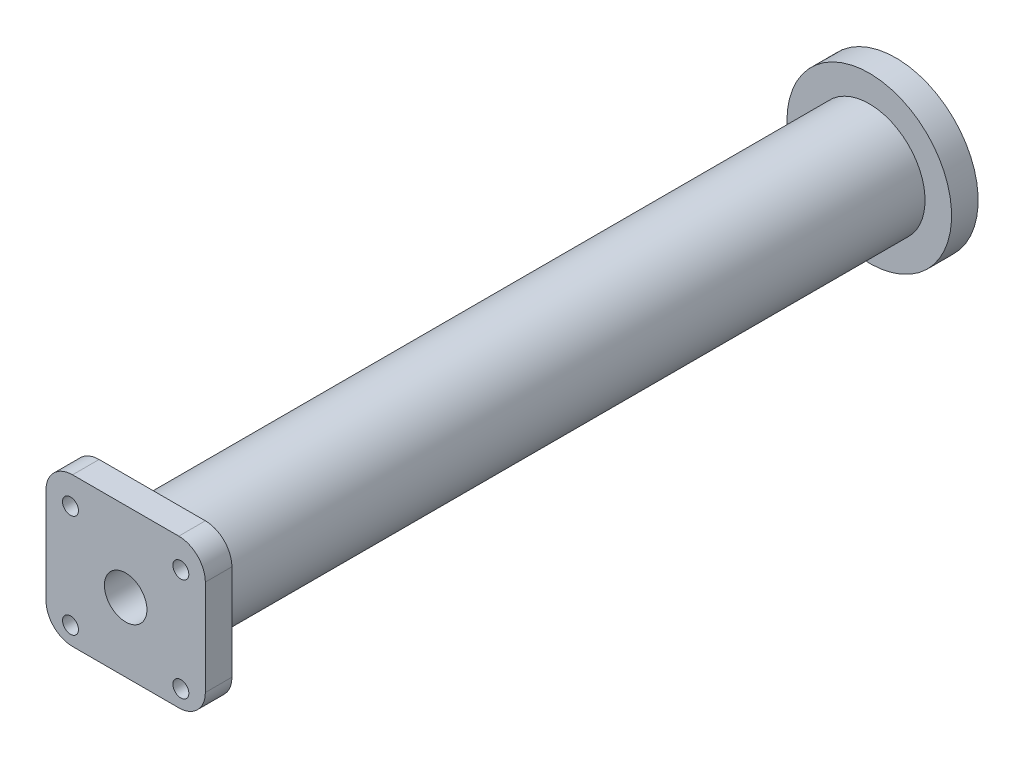
ISO-10303-21;
HEADER;
FILE_DESCRIPTION(('STEP AP214'),'2;1');
FILE_NAME('part.step','',(''),(''),'','','');
FILE_SCHEMA(('AUTOMOTIVE_DESIGN { 1 0 10303 214 1 1 1 1 }'));
ENDSEC;
DATA;
#1=APPLICATION_CONTEXT('core data for automotive mechanical design processes');
#2=APPLICATION_PROTOCOL_DEFINITION('international standard','automotive_design',2000,#1);
#3=PRODUCT_CONTEXT('',#1,'mechanical');
#4=PRODUCT('Part','Part','',(#3));
#5=PRODUCT_RELATED_PRODUCT_CATEGORY('part','',(#4));
#6=PRODUCT_DEFINITION_FORMATION('','',#4);
#7=PRODUCT_DEFINITION_CONTEXT('part definition',#1,'design');
#8=PRODUCT_DEFINITION('design','',#6,#7);
#9=PRODUCT_DEFINITION_SHAPE('','',#8);
#10=(LENGTH_UNIT() NAMED_UNIT(*) SI_UNIT(.MILLI.,.METRE.));
#11=(NAMED_UNIT(*) PLANE_ANGLE_UNIT() SI_UNIT($,.RADIAN.));
#12=(NAMED_UNIT(*) SI_UNIT($,.STERADIAN.) SOLID_ANGLE_UNIT());
#13=UNCERTAINTY_MEASURE_WITH_UNIT(LENGTH_MEASURE(1.E-05),#10,'distance_accuracy_value','');
#14=(GEOMETRIC_REPRESENTATION_CONTEXT(3) GLOBAL_UNCERTAINTY_ASSIGNED_CONTEXT((#13)) GLOBAL_UNIT_ASSIGNED_CONTEXT((#10,
#11,#12)) REPRESENTATION_CONTEXT('',''));
#15=CARTESIAN_POINT('',(0.,0.,0.));
#16=DIRECTION('',(0.,0.,1.));
#17=DIRECTION('',(1.,0.,0.));
#18=AXIS2_PLACEMENT_3D('',#15,#16,#17);
#19=CARTESIAN_POINT('',(0.,0.,140.));
#20=DIRECTION('',(0.,0.,-1.));
#21=DIRECTION('',(-1.,0.,0.));
#22=AXIS2_PLACEMENT_3D('',#19,#20,#21);
#23=CYLINDRICAL_SURFACE('',#22,10.5);
#24=CARTESIAN_POINT('',(0.,0.,140.));
#25=DIRECTION('',(0.,0.,1.));
#26=DIRECTION('',(1.,0.,0.));
#27=AXIS2_PLACEMENT_3D('',#24,#25,#26);
#28=CIRCLE('',#27,10.5);
#29=CARTESIAN_POINT('',(10.5,0.,140.));
#30=VERTEX_POINT('',#29);
#31=EDGE_CURVE('E159',#30,#30,#28,.T.);
#32=ORIENTED_EDGE('',*,*,#31,.F.);
#33=EDGE_LOOP('',(#32));
#34=FACE_BOUND('',#33,.T.);
#35=CARTESIAN_POINT('',(0.,0.,5.));
#36=DIRECTION('',(0.,0.,-1.));
#37=DIRECTION('',(-1.,0.,0.));
#38=AXIS2_PLACEMENT_3D('',#35,#36,#37);
#39=CIRCLE('',#38,10.5);
#40=CARTESIAN_POINT('',(-10.5,0.,5.));
#41=VERTEX_POINT('',#40);
#42=EDGE_CURVE('E12',#41,#41,#39,.T.);
#43=ORIENTED_EDGE('',*,*,#42,.F.);
#44=EDGE_LOOP('',(#43));
#45=FACE_BOUND('',#44,.T.);
#46=ADVANCED_FACE('F45',(#34,#45),#23,.T.);
#47=CARTESIAN_POINT('',(0.,0.,0.));
#48=DIRECTION('',(0.,0.,1.));
#49=DIRECTION('',(1.,0.,0.));
#50=AXIS2_PLACEMENT_3D('',#47,#48,#49);
#51=PLANE('',#50);
#52=CARTESIAN_POINT('',(0.,0.,0.));
#53=DIRECTION('',(0.,0.,1.));
#54=DIRECTION('',(1.,0.,0.));
#55=AXIS2_PLACEMENT_3D('',#52,#53,#54);
#56=CIRCLE('',#55,4.);
#57=CARTESIAN_POINT('',(4.,0.,0.));
#58=VERTEX_POINT('',#57);
#59=EDGE_CURVE('E156',#58,#58,#56,.T.);
#60=ORIENTED_EDGE('',*,*,#59,.T.);
#61=EDGE_LOOP('',(#60));
#62=FACE_BOUND('',#61,.T.);
#63=CARTESIAN_POINT('',(0.,0.,0.));
#64=DIRECTION('',(0.,0.,-1.));
#65=DIRECTION('',(-1.,0.,0.));
#66=AXIS2_PLACEMENT_3D('',#63,#64,#65);
#67=CIRCLE('',#66,15.5);
#68=CARTESIAN_POINT('',(-15.5,0.,0.));
#69=VERTEX_POINT('',#68);
#70=EDGE_CURVE('E224',#69,#69,#67,.T.);
#71=ORIENTED_EDGE('',*,*,#70,.T.);
#72=EDGE_LOOP('',(#71));
#73=FACE_BOUND('',#72,.T.);
#74=ADVANCED_FACE('F242',(#62,#73),#51,.F.);
#75=CARTESIAN_POINT('',(0.,0.,140.));
#76=DIRECTION('',(0.,0.,-1.));
#77=DIRECTION('',(-1.,0.,0.));
#78=AXIS2_PLACEMENT_3D('',#75,#76,#77);
#79=CYLINDRICAL_SURFACE('',#78,4.);
#80=ORIENTED_EDGE('',*,*,#59,.F.);
#81=EDGE_LOOP('',(#80));
#82=FACE_BOUND('',#81,.T.);
#83=CARTESIAN_POINT('',(0.,0.,145.));
#84=DIRECTION('',(0.,0.,1.));
#85=DIRECTION('',(1.,0.,0.));
#86=AXIS2_PLACEMENT_3D('',#83,#84,#85);
#87=CIRCLE('',#86,4.);
#88=CARTESIAN_POINT('',(4.,0.,145.));
#89=VERTEX_POINT('',#88);
#90=EDGE_CURVE('E218',#89,#89,#87,.T.);
#91=ORIENTED_EDGE('',*,*,#90,.T.);
#92=EDGE_LOOP('',(#91));
#93=FACE_BOUND('',#92,.T.);
#94=ADVANCED_FACE('F250',(#82,#93),#79,.F.);
#95=CARTESIAN_POINT('',(0.,0.,145.));
#96=DIRECTION('',(0.,0.,1.));
#97=DIRECTION('',(1.,0.,0.));
#98=AXIS2_PLACEMENT_3D('',#95,#96,#97);
#99=PLANE('',#98);
#100=CARTESIAN_POINT('',(-10.3882953617312,-9.69574233761576,145.));
#101=DIRECTION('',(0.,0.,1.));
#102=DIRECTION('',(1.,0.,0.));
#103=AXIS2_PLACEMENT_3D('',#100,#101,#102);
#104=CIRCLE('',#103,1.5);
#105=CARTESIAN_POINT('',(-8.88829536173118,-9.69574233761576,145.));
#106=VERTEX_POINT('',#105);
#107=EDGE_CURVE('E212',#106,#106,#104,.T.);
#108=ORIENTED_EDGE('',*,*,#107,.F.);
#109=EDGE_LOOP('',(#108));
#110=FACE_BOUND('',#109,.T.);
#111=CARTESIAN_POINT('',(10.3882953617312,-9.69574233761576,145.));
#112=DIRECTION('',(0.,0.,1.));
#113=DIRECTION('',(1.,0.,0.));
#114=AXIS2_PLACEMENT_3D('',#111,#112,#113);
#115=CIRCLE('',#114,1.5);
#116=CARTESIAN_POINT('',(11.8882953617312,-9.69574233761576,145.));
#117=VERTEX_POINT('',#116);
#118=EDGE_CURVE('E201',#117,#117,#115,.T.);
#119=ORIENTED_EDGE('',*,*,#118,.F.);
#120=EDGE_LOOP('',(#119));
#121=FACE_BOUND('',#120,.T.);
#122=DIRECTION('',(1.,0.,0.));
#123=VECTOR('',#122,1.);
#124=CARTESIAN_POINT('',(-15.,-13.,145.));
#125=LINE('',#124,#123);
#126=CARTESIAN_POINT('',(-10.,-13.,145.));
#127=VERTEX_POINT('',#126);
#128=CARTESIAN_POINT('',(10.,-13.,145.));
#129=VERTEX_POINT('',#128);
#130=EDGE_CURVE('E150',#127,#129,#125,.T.);
#131=ORIENTED_EDGE('',*,*,#130,.T.);
#132=CARTESIAN_POINT('',(10.,-8.,145.));
#133=DIRECTION('',(0.,0.,1.));
#134=DIRECTION('',(1.,0.,0.));
#135=AXIS2_PLACEMENT_3D('',#132,#133,#134);
#136=CIRCLE('',#135,5.);
#137=CARTESIAN_POINT('',(15.,-8.,145.));
#138=VERTEX_POINT('',#137);
#139=EDGE_CURVE('E174',#129,#138,#136,.T.);
#140=ORIENTED_EDGE('',*,*,#139,.T.);
#141=DIRECTION('',(0.,1.,0.));
#142=VECTOR('',#141,1.);
#143=CARTESIAN_POINT('',(15.,15.,145.));
#144=LINE('',#143,#142);
#145=CARTESIAN_POINT('',(15.,10.,145.));
#146=VERTEX_POINT('',#145);
#147=EDGE_CURVE('E132',#138,#146,#144,.T.);
#148=ORIENTED_EDGE('',*,*,#147,.T.);
#149=CARTESIAN_POINT('',(10.,10.,145.));
#150=DIRECTION('',(0.,0.,1.));
#151=DIRECTION('',(1.,0.,0.));
#152=AXIS2_PLACEMENT_3D('',#149,#150,#151);
#153=CIRCLE('',#152,5.);
#154=CARTESIAN_POINT('',(10.,15.,145.));
#155=VERTEX_POINT('',#154);
#156=EDGE_CURVE('E170',#146,#155,#153,.T.);
#157=ORIENTED_EDGE('',*,*,#156,.T.);
#158=DIRECTION('',(-1.,0.,0.));
#159=VECTOR('',#158,1.);
#160=CARTESIAN_POINT('',(-15.,15.,145.));
#161=LINE('',#160,#159);
#162=CARTESIAN_POINT('',(-10.,15.,145.));
#163=VERTEX_POINT('',#162);
#164=EDGE_CURVE('E187',#155,#163,#161,.T.);
#165=ORIENTED_EDGE('',*,*,#164,.T.);
#166=CARTESIAN_POINT('',(-10.,10.,145.));
#167=DIRECTION('',(0.,0.,1.));
#168=DIRECTION('',(1.,0.,0.));
#169=AXIS2_PLACEMENT_3D('',#166,#167,#168);
#170=CIRCLE('',#169,5.);
#171=CARTESIAN_POINT('',(-15.,10.,145.));
#172=VERTEX_POINT('',#171);
#173=EDGE_CURVE('E67',#163,#172,#170,.T.);
#174=ORIENTED_EDGE('',*,*,#173,.T.);
#175=DIRECTION('',(0.,-1.,0.));
#176=VECTOR('',#175,1.);
#177=CARTESIAN_POINT('',(-15.,15.,145.));
#178=LINE('',#177,#176);
#179=CARTESIAN_POINT('',(-15.,-8.,145.));
#180=VERTEX_POINT('',#179);
#181=EDGE_CURVE('E194',#172,#180,#178,.T.);
#182=ORIENTED_EDGE('',*,*,#181,.T.);
#183=CARTESIAN_POINT('',(-10.,-8.,145.));
#184=DIRECTION('',(0.,0.,1.));
#185=DIRECTION('',(1.,0.,0.));
#186=AXIS2_PLACEMENT_3D('',#183,#184,#185);
#187=CIRCLE('',#186,5.);
#188=EDGE_CURVE('E172',#180,#127,#187,.T.);
#189=ORIENTED_EDGE('',*,*,#188,.T.);
#190=EDGE_LOOP('',(#131,#140,#148,#157,#165,#174,#182,#189));
#191=FACE_BOUND('',#190,.T.);
#192=CARTESIAN_POINT('',(-10.3882953617312,9.69574233761576,145.));
#193=DIRECTION('',(0.,0.,1.));
#194=DIRECTION('',(1.,0.,0.));
#195=AXIS2_PLACEMENT_3D('',#192,#193,#194);
#196=CIRCLE('',#195,1.5);
#197=CARTESIAN_POINT('',(-8.88829536173118,9.69574233761576,145.));
#198=VERTEX_POINT('',#197);
#199=EDGE_CURVE('E141',#198,#198,#196,.T.);
#200=ORIENTED_EDGE('',*,*,#199,.F.);
#201=EDGE_LOOP('',(#200));
#202=FACE_BOUND('',#201,.T.);
#203=CARTESIAN_POINT('',(10.3882953617312,9.69574233761576,145.));
#204=DIRECTION('',(0.,0.,1.));
#205=DIRECTION('',(1.,0.,0.));
#206=AXIS2_PLACEMENT_3D('',#203,#204,#205);
#207=CIRCLE('',#206,1.5);
#208=CARTESIAN_POINT('',(11.8882953617312,9.69574233761576,145.));
#209=VERTEX_POINT('',#208);
#210=EDGE_CURVE('E206',#209,#209,#207,.T.);
#211=ORIENTED_EDGE('',*,*,#210,.F.);
#212=EDGE_LOOP('',(#211));
#213=FACE_BOUND('',#212,.T.);
#214=ORIENTED_EDGE('',*,*,#90,.F.);
#215=EDGE_LOOP('',(#214));
#216=FACE_BOUND('',#215,.T.);
#217=ADVANCED_FACE('F268',(#110,#121,#191,#202,#213,#216),#99,.T.);
#218=CARTESIAN_POINT('',(0.,0.,140.));
#219=DIRECTION('',(0.,0.,1.));
#220=DIRECTION('',(1.,0.,0.));
#221=AXIS2_PLACEMENT_3D('',#218,#219,#220);
#222=PLANE('',#221);
#223=ORIENTED_EDGE('',*,*,#31,.T.);
#224=EDGE_LOOP('',(#223));
#225=FACE_BOUND('',#224,.T.);
#226=DIRECTION('',(0.,1.,0.));
#227=VECTOR('',#226,1.);
#228=CARTESIAN_POINT('',(15.,15.,140.));
#229=LINE('',#228,#227);
#230=CARTESIAN_POINT('',(15.,-8.,140.));
#231=VERTEX_POINT('',#230);
#232=CARTESIAN_POINT('',(15.,10.,140.));
#233=VERTEX_POINT('',#232);
#234=EDGE_CURVE('E129',#231,#233,#229,.T.);
#235=ORIENTED_EDGE('',*,*,#234,.F.);
#236=CARTESIAN_POINT('',(10.,-8.,140.));
#237=DIRECTION('',(0.,0.,1.));
#238=DIRECTION('',(1.,0.,0.));
#239=AXIS2_PLACEMENT_3D('',#236,#237,#238);
#240=CIRCLE('',#239,5.);
#241=CARTESIAN_POINT('',(10.,-13.,140.));
#242=VERTEX_POINT('',#241);
#243=EDGE_CURVE('E112',#231,#242,#240,.F.);
#244=ORIENTED_EDGE('',*,*,#243,.T.);
#245=DIRECTION('',(1.,0.,0.));
#246=VECTOR('',#245,1.);
#247=CARTESIAN_POINT('',(-15.,-13.,140.));
#248=LINE('',#247,#246);
#249=CARTESIAN_POINT('',(-10.,-13.,140.));
#250=VERTEX_POINT('',#249);
#251=EDGE_CURVE('E154',#250,#242,#248,.T.);
#252=ORIENTED_EDGE('',*,*,#251,.F.);
#253=CARTESIAN_POINT('',(-10.,-8.,140.));
#254=DIRECTION('',(0.,0.,1.));
#255=DIRECTION('',(1.,0.,0.));
#256=AXIS2_PLACEMENT_3D('',#253,#254,#255);
#257=CIRCLE('',#256,5.);
#258=CARTESIAN_POINT('',(-15.,-8.,140.));
#259=VERTEX_POINT('',#258);
#260=EDGE_CURVE('E123',#250,#259,#257,.F.);
#261=ORIENTED_EDGE('',*,*,#260,.T.);
#262=DIRECTION('',(0.,-1.,0.));
#263=VECTOR('',#262,1.);
#264=CARTESIAN_POINT('',(-15.,15.,140.));
#265=LINE('',#264,#263);
#266=CARTESIAN_POINT('',(-15.,10.,140.));
#267=VERTEX_POINT('',#266);
#268=EDGE_CURVE('E144',#267,#259,#265,.T.);
#269=ORIENTED_EDGE('',*,*,#268,.F.);
#270=CARTESIAN_POINT('',(-10.,10.,140.));
#271=DIRECTION('',(0.,0.,1.));
#272=DIRECTION('',(1.,0.,0.));
#273=AXIS2_PLACEMENT_3D('',#270,#271,#272);
#274=CIRCLE('',#273,5.);
#275=CARTESIAN_POINT('',(-10.,15.,140.));
#276=VERTEX_POINT('',#275);
#277=EDGE_CURVE('E133',#267,#276,#274,.F.);
#278=ORIENTED_EDGE('',*,*,#277,.T.);
#279=DIRECTION('',(-1.,0.,0.));
#280=VECTOR('',#279,1.);
#281=CARTESIAN_POINT('',(-15.,15.,140.));
#282=LINE('',#281,#280);
#283=CARTESIAN_POINT('',(10.,15.,140.));
#284=VERTEX_POINT('',#283);
#285=EDGE_CURVE('E140',#284,#276,#282,.T.);
#286=ORIENTED_EDGE('',*,*,#285,.F.);
#287=CARTESIAN_POINT('',(10.,10.,140.));
#288=DIRECTION('',(0.,0.,1.));
#289=DIRECTION('',(1.,0.,0.));
#290=AXIS2_PLACEMENT_3D('',#287,#288,#289);
#291=CIRCLE('',#290,5.);
#292=EDGE_CURVE('E139',#284,#233,#291,.F.);
#293=ORIENTED_EDGE('',*,*,#292,.T.);
#294=EDGE_LOOP('',(#235,#244,#252,#261,#269,#278,#286,#293));
#295=FACE_BOUND('',#294,.T.);
#296=CARTESIAN_POINT('',(-10.3882953617312,9.69574233761576,140.));
#297=DIRECTION('',(0.,0.,1.));
#298=DIRECTION('',(1.,0.,0.));
#299=AXIS2_PLACEMENT_3D('',#296,#297,#298);
#300=CIRCLE('',#299,1.5);
#301=CARTESIAN_POINT('',(-8.88829536173118,9.69574233761576,140.));
#302=VERTEX_POINT('',#301);
#303=EDGE_CURVE('E147',#302,#302,#300,.T.);
#304=ORIENTED_EDGE('',*,*,#303,.T.);
#305=EDGE_LOOP('',(#304));
#306=FACE_BOUND('',#305,.T.);
#307=CARTESIAN_POINT('',(10.3882953617312,-9.69574233761576,140.));
#308=DIRECTION('',(0.,0.,1.));
#309=DIRECTION('',(1.,0.,0.));
#310=AXIS2_PLACEMENT_3D('',#307,#308,#309);
#311=CIRCLE('',#310,1.5);
#312=CARTESIAN_POINT('',(11.8882953617312,-9.69574233761576,140.));
#313=VERTEX_POINT('',#312);
#314=EDGE_CURVE('E203',#313,#313,#311,.T.);
#315=ORIENTED_EDGE('',*,*,#314,.T.);
#316=EDGE_LOOP('',(#315));
#317=FACE_BOUND('',#316,.T.);
#318=CARTESIAN_POINT('',(10.3882953617312,9.69574233761576,140.));
#319=DIRECTION('',(0.,0.,1.));
#320=DIRECTION('',(1.,0.,0.));
#321=AXIS2_PLACEMENT_3D('',#318,#319,#320);
#322=CIRCLE('',#321,1.5);
#323=CARTESIAN_POINT('',(11.8882953617312,9.69574233761576,140.));
#324=VERTEX_POINT('',#323);
#325=EDGE_CURVE('E209',#324,#324,#322,.T.);
#326=ORIENTED_EDGE('',*,*,#325,.T.);
#327=EDGE_LOOP('',(#326));
#328=FACE_BOUND('',#327,.T.);
#329=CARTESIAN_POINT('',(-10.3882953617312,-9.69574233761576,140.));
#330=DIRECTION('',(0.,0.,1.));
#331=DIRECTION('',(1.,0.,0.));
#332=AXIS2_PLACEMENT_3D('',#329,#330,#331);
#333=CIRCLE('',#332,1.5);
#334=CARTESIAN_POINT('',(-8.88829536173118,-9.69574233761576,140.));
#335=VERTEX_POINT('',#334);
#336=EDGE_CURVE('E215',#335,#335,#333,.T.);
#337=ORIENTED_EDGE('',*,*,#336,.T.);
#338=EDGE_LOOP('',(#337));
#339=FACE_BOUND('',#338,.T.);
#340=ADVANCED_FACE('F136',(#225,#295,#306,#317,#328,#339),#222,.F.);
#341=CARTESIAN_POINT('',(15.,15.,145.));
#342=DIRECTION('',(-1.,0.,0.));
#343=DIRECTION('',(0.,-1.,0.));
#344=AXIS2_PLACEMENT_3D('',#341,#342,#343);
#345=PLANE('',#344);
#346=ORIENTED_EDGE('',*,*,#147,.F.);
#347=DIRECTION('',(0.,0.,-1.));
#348=VECTOR('',#347,1.);
#349=CARTESIAN_POINT('',(15.,-8.,145.));
#350=LINE('',#349,#348);
#351=EDGE_CURVE('E116',#138,#231,#350,.T.);
#352=ORIENTED_EDGE('',*,*,#351,.T.);
#353=ORIENTED_EDGE('',*,*,#234,.T.);
#354=DIRECTION('',(0.,0.,-1.));
#355=VECTOR('',#354,1.);
#356=CARTESIAN_POINT('',(15.,10.,145.));
#357=LINE('',#356,#355);
#358=EDGE_CURVE('E134',#233,#146,#357,.F.);
#359=ORIENTED_EDGE('',*,*,#358,.T.);
#360=EDGE_LOOP('',(#346,#352,#353,#359));
#361=FACE_BOUND('',#360,.T.);
#362=ADVANCED_FACE('F128',(#361),#345,.F.);
#363=CARTESIAN_POINT('',(-15.,15.,145.));
#364=DIRECTION('',(0.,-1.,0.));
#365=DIRECTION('',(0.,0.,-1.));
#366=AXIS2_PLACEMENT_3D('',#363,#364,#365);
#367=PLANE('',#366);
#368=ORIENTED_EDGE('',*,*,#164,.F.);
#369=DIRECTION('',(0.,0.,-1.));
#370=VECTOR('',#369,1.);
#371=CARTESIAN_POINT('',(10.,15.,145.));
#372=LINE('',#371,#370);
#373=EDGE_CURVE('E53',#155,#284,#372,.T.);
#374=ORIENTED_EDGE('',*,*,#373,.T.);
#375=ORIENTED_EDGE('',*,*,#285,.T.);
#376=DIRECTION('',(0.,0.,-1.));
#377=VECTOR('',#376,1.);
#378=CARTESIAN_POINT('',(-10.,15.,145.));
#379=LINE('',#378,#377);
#380=EDGE_CURVE('E180',#276,#163,#379,.F.);
#381=ORIENTED_EDGE('',*,*,#380,.T.);
#382=EDGE_LOOP('',(#368,#374,#375,#381));
#383=FACE_BOUND('',#382,.T.);
#384=ADVANCED_FACE('F185',(#383),#367,.F.);
#385=CARTESIAN_POINT('',(-15.,15.,145.));
#386=DIRECTION('',(1.,0.,0.));
#387=DIRECTION('',(0.,1.,0.));
#388=AXIS2_PLACEMENT_3D('',#385,#386,#387);
#389=PLANE('',#388);
#390=ORIENTED_EDGE('',*,*,#268,.T.);
#391=DIRECTION('',(0.,0.,-1.));
#392=VECTOR('',#391,1.);
#393=CARTESIAN_POINT('',(-15.,-8.,145.));
#394=LINE('',#393,#392);
#395=EDGE_CURVE('E60',#259,#180,#394,.F.);
#396=ORIENTED_EDGE('',*,*,#395,.T.);
#397=ORIENTED_EDGE('',*,*,#181,.F.);
#398=DIRECTION('',(0.,0.,-1.));
#399=VECTOR('',#398,1.);
#400=CARTESIAN_POINT('',(-15.,10.,145.));
#401=LINE('',#400,#399);
#402=EDGE_CURVE('E176',#172,#267,#401,.T.);
#403=ORIENTED_EDGE('',*,*,#402,.T.);
#404=EDGE_LOOP('',(#390,#396,#397,#403));
#405=FACE_BOUND('',#404,.T.);
#406=ADVANCED_FACE('F193',(#405),#389,.F.);
#407=CARTESIAN_POINT('',(-15.,-13.,145.));
#408=DIRECTION('',(0.,1.,0.));
#409=DIRECTION('',(0.,0.,1.));
#410=AXIS2_PLACEMENT_3D('',#407,#408,#409);
#411=PLANE('',#410);
#412=ORIENTED_EDGE('',*,*,#251,.T.);
#413=DIRECTION('',(0.,0.,-1.));
#414=VECTOR('',#413,1.);
#415=CARTESIAN_POINT('',(10.,-13.,145.));
#416=LINE('',#415,#414);
#417=EDGE_CURVE('E117',#242,#129,#416,.F.);
#418=ORIENTED_EDGE('',*,*,#417,.T.);
#419=ORIENTED_EDGE('',*,*,#130,.F.);
#420=DIRECTION('',(0.,0.,-1.));
#421=VECTOR('',#420,1.);
#422=CARTESIAN_POINT('',(-10.,-13.,145.));
#423=LINE('',#422,#421);
#424=EDGE_CURVE('E122',#127,#250,#423,.T.);
#425=ORIENTED_EDGE('',*,*,#424,.T.);
#426=EDGE_LOOP('',(#412,#418,#419,#425));
#427=FACE_BOUND('',#426,.T.);
#428=ADVANCED_FACE('F273',(#427),#411,.F.);
#429=CARTESIAN_POINT('',(-10.3882953617312,9.69574233761576,145.));
#430=DIRECTION('',(0.,0.,-1.));
#431=DIRECTION('',(-1.,0.,0.));
#432=AXIS2_PLACEMENT_3D('',#429,#430,#431);
#433=CYLINDRICAL_SURFACE('',#432,1.5);
#434=ORIENTED_EDGE('',*,*,#199,.T.);
#435=EDGE_LOOP('',(#434));
#436=FACE_BOUND('',#435,.T.);
#437=ORIENTED_EDGE('',*,*,#303,.F.);
#438=EDGE_LOOP('',(#437));
#439=FACE_BOUND('',#438,.T.);
#440=ADVANCED_FACE('F275',(#436,#439),#433,.F.);
#441=CARTESIAN_POINT('',(10.3882953617312,-9.69574233761576,145.));
#442=DIRECTION('',(0.,0.,-1.));
#443=DIRECTION('',(-1.,0.,0.));
#444=AXIS2_PLACEMENT_3D('',#441,#442,#443);
#445=CYLINDRICAL_SURFACE('',#444,1.5);
#446=ORIENTED_EDGE('',*,*,#118,.T.);
#447=EDGE_LOOP('',(#446));
#448=FACE_BOUND('',#447,.T.);
#449=ORIENTED_EDGE('',*,*,#314,.F.);
#450=EDGE_LOOP('',(#449));
#451=FACE_BOUND('',#450,.T.);
#452=ADVANCED_FACE('F281',(#448,#451),#445,.F.);
#453=CARTESIAN_POINT('',(10.3882953617312,9.69574233761576,145.));
#454=DIRECTION('',(0.,0.,-1.));
#455=DIRECTION('',(-1.,0.,0.));
#456=AXIS2_PLACEMENT_3D('',#453,#454,#455);
#457=CYLINDRICAL_SURFACE('',#456,1.5);
#458=ORIENTED_EDGE('',*,*,#210,.T.);
#459=EDGE_LOOP('',(#458));
#460=FACE_BOUND('',#459,.T.);
#461=ORIENTED_EDGE('',*,*,#325,.F.);
#462=EDGE_LOOP('',(#461));
#463=FACE_BOUND('',#462,.T.);
#464=ADVANCED_FACE('F312',(#460,#463),#457,.F.);
#465=CARTESIAN_POINT('',(-10.3882953617312,-9.69574233761576,145.));
#466=DIRECTION('',(0.,0.,-1.));
#467=DIRECTION('',(-1.,0.,0.));
#468=AXIS2_PLACEMENT_3D('',#465,#466,#467);
#469=CYLINDRICAL_SURFACE('',#468,1.5);
#470=ORIENTED_EDGE('',*,*,#107,.T.);
#471=EDGE_LOOP('',(#470));
#472=FACE_BOUND('',#471,.T.);
#473=ORIENTED_EDGE('',*,*,#336,.F.);
#474=EDGE_LOOP('',(#473));
#475=FACE_BOUND('',#474,.T.);
#476=ADVANCED_FACE('F260',(#472,#475),#469,.F.);
#477=CARTESIAN_POINT('',(10.,-8.,145.));
#478=DIRECTION('',(0.,0.,-1.));
#479=DIRECTION('',(-1.,0.,0.));
#480=AXIS2_PLACEMENT_3D('',#477,#478,#479);
#481=CYLINDRICAL_SURFACE('',#480,5.);
#482=ORIENTED_EDGE('',*,*,#139,.F.);
#483=ORIENTED_EDGE('',*,*,#417,.F.);
#484=ORIENTED_EDGE('',*,*,#243,.F.);
#485=ORIENTED_EDGE('',*,*,#351,.F.);
#486=EDGE_LOOP('',(#482,#483,#484,#485));
#487=FACE_BOUND('',#486,.T.);
#488=ADVANCED_FACE('F115',(#487),#481,.T.);
#489=CARTESIAN_POINT('',(-10.,-8.,145.));
#490=DIRECTION('',(0.,0.,-1.));
#491=DIRECTION('',(-1.,0.,0.));
#492=AXIS2_PLACEMENT_3D('',#489,#490,#491);
#493=CYLINDRICAL_SURFACE('',#492,5.);
#494=ORIENTED_EDGE('',*,*,#188,.F.);
#495=ORIENTED_EDGE('',*,*,#395,.F.);
#496=ORIENTED_EDGE('',*,*,#260,.F.);
#497=ORIENTED_EDGE('',*,*,#424,.F.);
#498=EDGE_LOOP('',(#494,#495,#496,#497));
#499=FACE_BOUND('',#498,.T.);
#500=ADVANCED_FACE('F259',(#499),#493,.T.);
#501=CARTESIAN_POINT('',(10.,10.,145.));
#502=DIRECTION('',(0.,0.,-1.));
#503=DIRECTION('',(-1.,0.,0.));
#504=AXIS2_PLACEMENT_3D('',#501,#502,#503);
#505=CYLINDRICAL_SURFACE('',#504,5.);
#506=ORIENTED_EDGE('',*,*,#156,.F.);
#507=ORIENTED_EDGE('',*,*,#358,.F.);
#508=ORIENTED_EDGE('',*,*,#292,.F.);
#509=ORIENTED_EDGE('',*,*,#373,.F.);
#510=EDGE_LOOP('',(#506,#507,#508,#509));
#511=FACE_BOUND('',#510,.T.);
#512=ADVANCED_FACE('F262',(#511),#505,.T.);
#513=CARTESIAN_POINT('',(-10.,10.,145.));
#514=DIRECTION('',(0.,0.,-1.));
#515=DIRECTION('',(-1.,0.,0.));
#516=AXIS2_PLACEMENT_3D('',#513,#514,#515);
#517=CYLINDRICAL_SURFACE('',#516,5.);
#518=ORIENTED_EDGE('',*,*,#173,.F.);
#519=ORIENTED_EDGE('',*,*,#380,.F.);
#520=ORIENTED_EDGE('',*,*,#277,.F.);
#521=ORIENTED_EDGE('',*,*,#402,.F.);
#522=EDGE_LOOP('',(#518,#519,#520,#521));
#523=FACE_BOUND('',#522,.T.);
#524=ADVANCED_FACE('F47',(#523),#517,.T.);
#525=CARTESIAN_POINT('',(0.,0.,5.));
#526=DIRECTION('',(0.,0.,-1.));
#527=DIRECTION('',(-1.,0.,0.));
#528=AXIS2_PLACEMENT_3D('',#525,#526,#527);
#529=CYLINDRICAL_SURFACE('',#528,15.5);
#530=CARTESIAN_POINT('',(0.,0.,5.));
#531=DIRECTION('',(0.,0.,-1.));
#532=DIRECTION('',(-1.,0.,0.));
#533=AXIS2_PLACEMENT_3D('',#530,#531,#532);
#534=CIRCLE('',#533,15.5);
#535=CARTESIAN_POINT('',(-15.5,0.,5.));
#536=VERTEX_POINT('',#535);
#537=EDGE_CURVE('E223',#536,#536,#534,.T.);
#538=ORIENTED_EDGE('',*,*,#537,.T.);
#539=EDGE_LOOP('',(#538));
#540=FACE_BOUND('',#539,.T.);
#541=ORIENTED_EDGE('',*,*,#70,.F.);
#542=EDGE_LOOP('',(#541));
#543=FACE_BOUND('',#542,.T.);
#544=ADVANCED_FACE('F230',(#540,#543),#529,.T.);
#545=CARTESIAN_POINT('',(0.,0.,5.));
#546=DIRECTION('',(0.,0.,-1.));
#547=DIRECTION('',(-1.,0.,0.));
#548=AXIS2_PLACEMENT_3D('',#545,#546,#547);
#549=PLANE('',#548);
#550=ORIENTED_EDGE('',*,*,#42,.T.);
#551=EDGE_LOOP('',(#550));
#552=FACE_BOUND('',#551,.T.);
#553=ORIENTED_EDGE('',*,*,#537,.F.);
#554=EDGE_LOOP('',(#553));
#555=FACE_BOUND('',#554,.T.);
#556=ADVANCED_FACE('F233',(#552,#555),#549,.F.);
#557=CLOSED_SHELL('',(#46,#74,#94,#217,#340,#362,#384,#406,#428,#440,#452,#464,#476,#488,#500,
#512,#524,#544,#556));
#558=MANIFOLD_SOLID_BREP('B2',#557);
#559=ADVANCED_BREP_SHAPE_REPRESENTATION('',(#18,#558),#14);
#560=SHAPE_DEFINITION_REPRESENTATION(#9,#559);
ENDSEC;
END-ISO-10303-21;
